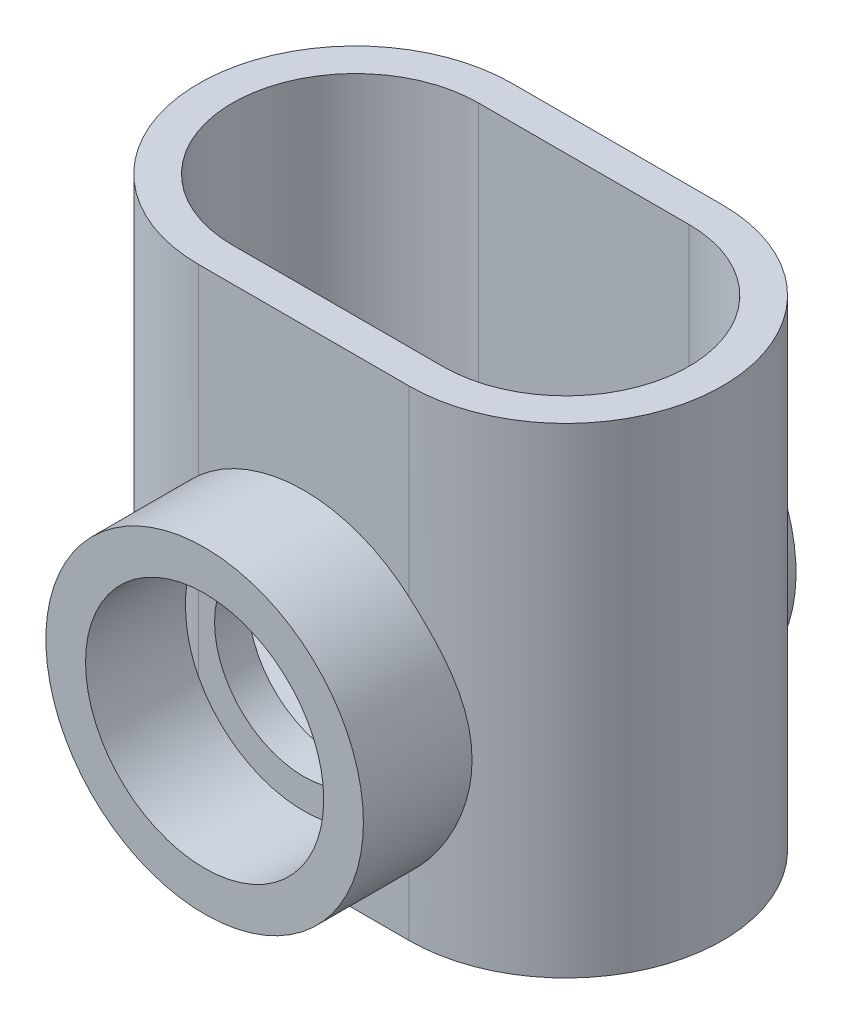
ISO-10303-21;
HEADER;
FILE_DESCRIPTION(('STEP AP214'),'2;1');
FILE_NAME('part.step','',(''),(''),'','','');
FILE_SCHEMA(('AUTOMOTIVE_DESIGN { 1 0 10303 214 1 1 1 1 }'));
ENDSEC;
DATA;
#1=APPLICATION_CONTEXT('core data for automotive mechanical design processes');
#2=APPLICATION_PROTOCOL_DEFINITION('international standard','automotive_design',2000,#1);
#3=PRODUCT_CONTEXT('',#1,'mechanical');
#4=PRODUCT('Part','Part','',(#3));
#5=PRODUCT_RELATED_PRODUCT_CATEGORY('part','',(#4));
#6=PRODUCT_DEFINITION_FORMATION('','',#4);
#7=PRODUCT_DEFINITION_CONTEXT('part definition',#1,'design');
#8=PRODUCT_DEFINITION('design','',#6,#7);
#9=PRODUCT_DEFINITION_SHAPE('','',#8);
#10=(LENGTH_UNIT() NAMED_UNIT(*) SI_UNIT(.MILLI.,.METRE.));
#11=(NAMED_UNIT(*) PLANE_ANGLE_UNIT() SI_UNIT($,.RADIAN.));
#12=(NAMED_UNIT(*) SI_UNIT($,.STERADIAN.) SOLID_ANGLE_UNIT());
#13=UNCERTAINTY_MEASURE_WITH_UNIT(LENGTH_MEASURE(1.E-05),#10,'distance_accuracy_value','');
#14=(GEOMETRIC_REPRESENTATION_CONTEXT(3) GLOBAL_UNCERTAINTY_ASSIGNED_CONTEXT((#13)) GLOBAL_UNIT_ASSIGNED_CONTEXT((#10,
#11,#12)) REPRESENTATION_CONTEXT('',''));
#15=CARTESIAN_POINT('',(0.,0.,0.));
#16=DIRECTION('',(0.,0.,1.));
#17=DIRECTION('',(1.,0.,0.));
#18=AXIS2_PLACEMENT_3D('',#15,#16,#17);
#19=CARTESIAN_POINT('',(0.,24.2,-7.9));
#20=DIRECTION('',(0.,0.,1.));
#21=DIRECTION('',(1.,0.,0.));
#22=AXIS2_PLACEMENT_3D('',#19,#20,#21);
#23=PLANE('',#22);
#24=CARTESIAN_POINT('',(5.3,9.,-7.9));
#25=DIRECTION('',(0.,0.,-1.));
#26=DIRECTION('',(-1.,0.,0.));
#27=AXIS2_PLACEMENT_3D('',#24,#25,#26);
#28=CIRCLE('',#27,8.);
#29=CARTESIAN_POINT('',(10.6,3.00750469336854,-7.9));
#30=VERTEX_POINT('',#29);
#31=CARTESIAN_POINT('',(0.,3.00750469336855,-7.9));
#32=VERTEX_POINT('',#31);
#33=EDGE_CURVE('E55',#30,#32,#28,.T.);
#34=ORIENTED_EDGE('',*,*,#33,.F.);
#35=DIRECTION('',(0.,-1.,0.));
#36=VECTOR('',#35,1.);
#37=CARTESIAN_POINT('',(10.6,24.2,-7.9));
#38=LINE('',#37,#36);
#39=CARTESIAN_POINT('',(10.6,0.,-7.9));
#40=VERTEX_POINT('',#39);
#41=EDGE_CURVE('E151',#30,#40,#38,.T.);
#42=ORIENTED_EDGE('',*,*,#41,.T.);
#43=DIRECTION('',(-1.,0.,0.));
#44=VECTOR('',#43,1.);
#45=CARTESIAN_POINT('',(0.,0.,-7.9));
#46=LINE('',#45,#44);
#47=CARTESIAN_POINT('',(0.,0.,-7.9));
#48=VERTEX_POINT('',#47);
#49=EDGE_CURVE('E304',#40,#48,#46,.T.);
#50=ORIENTED_EDGE('',*,*,#49,.T.);
#51=DIRECTION('',(0.,-1.,0.));
#52=VECTOR('',#51,1.);
#53=CARTESIAN_POINT('',(0.,24.2,-7.9));
#54=LINE('',#53,#52);
#55=EDGE_CURVE('E60',#32,#48,#54,.T.);
#56=ORIENTED_EDGE('',*,*,#55,.F.);
#57=EDGE_LOOP('',(#34,#42,#50,#56));
#58=FACE_BOUND('',#57,.T.);
#59=ADVANCED_FACE('F39',(#58),#23,.F.);
#60=CARTESIAN_POINT('',(0.,14.9924953066315,-7.9));
#61=VERTEX_POINT('',#60);
#62=CARTESIAN_POINT('',(10.6,14.9924953066315,-7.9));
#63=VERTEX_POINT('',#62);
#64=EDGE_CURVE('E145',#61,#63,#28,.T.);
#65=ORIENTED_EDGE('',*,*,#64,.F.);
#66=CARTESIAN_POINT('',(0.,24.2,-7.9));
#67=VERTEX_POINT('',#66);
#68=EDGE_CURVE('E301',#67,#61,#54,.T.);
#69=ORIENTED_EDGE('',*,*,#68,.F.);
#70=DIRECTION('',(-1.,0.,0.));
#71=VECTOR('',#70,1.);
#72=CARTESIAN_POINT('',(0.,24.2,-7.9));
#73=LINE('',#72,#71);
#74=CARTESIAN_POINT('',(10.6,24.2,-7.9));
#75=VERTEX_POINT('',#74);
#76=EDGE_CURVE('E147',#75,#67,#73,.T.);
#77=ORIENTED_EDGE('',*,*,#76,.F.);
#78=EDGE_CURVE('E140',#75,#63,#38,.T.);
#79=ORIENTED_EDGE('',*,*,#78,.T.);
#80=EDGE_LOOP('',(#65,#69,#77,#79));
#81=FACE_BOUND('',#80,.T.);
#82=ADVANCED_FACE('F142',(#81),#23,.F.);
#83=CARTESIAN_POINT('',(0.,24.2,7.9));
#84=DIRECTION('',(0.,0.,-1.));
#85=DIRECTION('',(-1.,0.,0.));
#86=AXIS2_PLACEMENT_3D('',#83,#84,#85);
#87=PLANE('',#86);
#88=DIRECTION('',(0.,-1.,0.));
#89=VECTOR('',#88,1.);
#90=CARTESIAN_POINT('',(0.,24.2,7.9));
#91=LINE('',#90,#89);
#92=CARTESIAN_POINT('',(0.,24.2,7.9));
#93=VERTEX_POINT('',#92);
#94=CARTESIAN_POINT('',(0.,14.9924953066315,7.9));
#95=VERTEX_POINT('',#94);
#96=EDGE_CURVE('E12',#93,#95,#91,.T.);
#97=ORIENTED_EDGE('',*,*,#96,.T.);
#98=CARTESIAN_POINT('',(5.3,9.,7.90000000000646));
#99=DIRECTION('',(0.,0.,-1.));
#100=DIRECTION('',(-1.,0.,0.));
#101=AXIS2_PLACEMENT_3D('',#98,#99,#100);
#102=CIRCLE('',#101,8.);
#103=CARTESIAN_POINT('',(10.6,14.9924953066315,7.90000000000646));
#104=VERTEX_POINT('',#103);
#105=EDGE_CURVE('E224',#104,#95,#102,.F.);
#106=ORIENTED_EDGE('',*,*,#105,.F.);
#107=DIRECTION('',(0.,-1.,0.));
#108=VECTOR('',#107,1.);
#109=CARTESIAN_POINT('',(10.6,24.2,7.9));
#110=LINE('',#109,#108);
#111=CARTESIAN_POINT('',(10.6,24.2,7.9));
#112=VERTEX_POINT('',#111);
#113=EDGE_CURVE('E306',#112,#104,#110,.T.);
#114=ORIENTED_EDGE('',*,*,#113,.F.);
#115=DIRECTION('',(1.,0.,0.));
#116=VECTOR('',#115,1.);
#117=CARTESIAN_POINT('',(0.,24.2,7.9));
#118=LINE('',#117,#116);
#119=EDGE_CURVE('E225',#93,#112,#118,.T.);
#120=ORIENTED_EDGE('',*,*,#119,.F.);
#121=EDGE_LOOP('',(#97,#106,#114,#120));
#122=FACE_BOUND('',#121,.T.);
#123=ADVANCED_FACE('F197',(#122),#87,.F.);
#124=CARTESIAN_POINT('',(0.,24.2,0.));
#125=DIRECTION('',(0.,-1.,0.));
#126=DIRECTION('',(0.,0.,-1.));
#127=AXIS2_PLACEMENT_3D('',#124,#125,#126);
#128=CYLINDRICAL_SURFACE('',#127,7.9);
#129=CARTESIAN_POINT('',(0.,3.00750469336854,7.9));
#130=VERTEX_POINT('',#129);
#131=CARTESIAN_POINT('',(0.,0.,7.9));
#132=VERTEX_POINT('',#131);
#133=EDGE_CURVE('E48',#130,#132,#91,.T.);
#134=ORIENTED_EDGE('',*,*,#133,.F.);
#135=CARTESIAN_POINT('',(0.,14.9924953066315,7.9));
#136=CARTESIAN_POINT('',(-0.165659654042323,14.8460206283481,7.89999934958821));
#137=CARTESIAN_POINT('',(-0.325125716478624,14.6927039418768,7.89479037197899));
#138=CARTESIAN_POINT('',(-0.630504441524312,14.3737955911347,7.87628349925471));
#139=CARTESIAN_POINT('',(-0.776428295026014,14.2082142692084,7.86299235286839));
#140=CARTESIAN_POINT('',(-1.05369916417834,13.8661061195597,7.83065711055396));
#141=CARTESIAN_POINT('',(-1.18506043031419,13.6895902605375,7.81161870787881));
#142=CARTESIAN_POINT('',(-1.43266342855662,13.326604945252,7.77002182860017));
#143=CARTESIAN_POINT('',(-1.54890200233335,13.1401334212094,7.74746261884344));
#144=CARTESIAN_POINT('',(-1.76535237537247,12.7588238090764,7.70102332508906));
#145=CARTESIAN_POINT('',(-1.86559896624349,12.5640050863881,7.67714626492542));
#146=CARTESIAN_POINT('',(-2.04980814620565,12.1667420014171,7.63002810366607));
#147=CARTESIAN_POINT('',(-2.13377095767161,11.9642977433155,7.60678699388942));
#148=CARTESIAN_POINT('',(-2.2848637203706,11.5530034457817,7.56277686205978));
#149=CARTESIAN_POINT('',(-2.35199730782574,11.3441548010832,7.54200730649843));
#150=CARTESIAN_POINT('',(-2.46895935597311,10.9212989348312,7.50453305494014));
#151=CARTESIAN_POINT('',(-2.51878765816819,10.7072916660496,7.48782839617354));
#152=CARTESIAN_POINT('',(-2.60164662354409,10.2706221716192,7.45945075989015));
#153=CARTESIAN_POINT('',(-2.63426802769808,10.0478738839944,7.44790130089661));
#154=CARTESIAN_POINT('',(-2.68062892361512,9.60017193729785,7.43134163705504));
#155=CARTESIAN_POINT('',(-2.69436829056254,9.37521826365782,7.42633147543363));
#156=CARTESIAN_POINT('',(-2.70281529175459,8.92497740375368,7.42326142735091));
#157=CARTESIAN_POINT('',(-2.69752899363168,8.69969034671917,7.42519932502571));
#158=CARTESIAN_POINT('',(-2.66799541178477,8.25053326748999,7.43586214006958));
#159=CARTESIAN_POINT('',(-2.64374875180376,8.0266631989246,7.44458683417194));
#160=CARTESIAN_POINT('',(-2.57843553069375,7.59454677883346,7.46744846645516));
#161=CARTESIAN_POINT('',(-2.53838725389512,7.3861277165097,7.48125484962938));
#162=CARTESIAN_POINT('',(-2.44196525949885,6.97345808200345,7.51328044972511));
#163=CARTESIAN_POINT('',(-2.38559191676759,6.76920741421895,7.53149956531713));
#164=CARTESIAN_POINT('',(-2.25685676397906,6.36584055140364,7.57107207794247));
#165=CARTESIAN_POINT('',(-2.18447473154368,6.1667312094253,7.5924294276768));
#166=CARTESIAN_POINT('',(-2.02422693440841,5.77502193449221,7.63671468134105));
#167=CARTESIAN_POINT('',(-1.93636049541726,5.58242228544709,7.65964265363947));
#168=CARTESIAN_POINT('',(-1.7409570056299,5.1955065058327,7.70646807783583));
#169=CARTESIAN_POINT('',(-1.63266660248392,5.00156941317087,7.73035793101838));
#170=CARTESIAN_POINT('',(-1.40016919144706,4.62312234081302,7.77583138310324));
#171=CARTESIAN_POINT('',(-1.27595843103882,4.43861459805509,7.79741443607322));
#172=CARTESIAN_POINT('',(-1.01273479136636,4.08079536807202,7.83594359951493));
#173=CARTESIAN_POINT('',(-0.873766114614969,3.90745281228961,7.85290304295537));
#174=CARTESIAN_POINT('',(-0.581654865537745,3.57271709921554,7.87992091926252));
#175=CARTESIAN_POINT('',(-0.428524086428894,3.41131419746685,7.88998503638584));
#176=CARTESIAN_POINT('',(-0.225048015561031,3.21401815693188,7.89691598622943));
#177=CARTESIAN_POINT('',(-0.180692272938848,3.17198573349581,7.89806066824444));
#178=CARTESIAN_POINT('',(-0.0910468224072934,3.08896451586404,7.89960238262781));
#179=CARTESIAN_POINT('',(-0.0457576352332591,3.04797516684869,7.89999982102299));
#180=CARTESIAN_POINT('',(0.,3.00750469336854,7.9));
#181=B_SPLINE_CURVE_WITH_KNOTS('',3,(#135,#136,#137,#138,#139,#140,#141,#142,#143,#144,#145,
#146,#147,#148,#149,#150,#151,#152,#153,#154,#155,#156,#157,#158,#159,#160,#161,#162,#163,#164,
#165,#166,#167,#168,#169,#170,#171,#172,#173,#174,#175,#176,#177,#178,#179,#180),.UNSPECIFIED.,
.F.,.F.,(4,2,2,2,2,2,2,2,2,2,2,2,2,2,2,2,2,2,2,2,2,2,4),(0.,0.662981875407768,1.32541091002921,
1.98718588144885,2.64909884151636,3.30955152723226,3.96999519302776,4.63029603620857,
5.2906029268507,5.96597762938779,6.64135679632178,7.31652059157958,7.99166217676743,
8.62898434784936,9.26629188550103,9.90440912344751,10.5425541560181,11.2119948281525,
11.8815935823791,12.5492405041256,13.2163363776241,13.3996777805269,13.58291953311),.UNSPECIFIED.);
#182=EDGE_CURVE('E231',#95,#130,#181,.T.);
#183=ORIENTED_EDGE('',*,*,#182,.F.);
#184=ORIENTED_EDGE('',*,*,#96,.F.);
#185=CARTESIAN_POINT('',(0.,24.2,0.));
#186=DIRECTION('',(0.,1.,0.));
#187=DIRECTION('',(0.,0.,1.));
#188=AXIS2_PLACEMENT_3D('',#185,#186,#187);
#189=CIRCLE('',#188,7.9);
#190=EDGE_CURVE('E230',#67,#93,#189,.T.);
#191=ORIENTED_EDGE('',*,*,#190,.F.);
#192=ORIENTED_EDGE('',*,*,#68,.T.);
#193=DIRECTION('',(0.,-1.,0.));
#194=VECTOR('',#193,1.);
#195=CARTESIAN_POINT('',(0.,24.2,-7.9));
#196=LINE('',#195,#194);
#197=EDGE_CURVE('E161',#61,#32,#196,.T.);
#198=ORIENTED_EDGE('',*,*,#197,.T.);
#199=ORIENTED_EDGE('',*,*,#55,.T.);
#200=CARTESIAN_POINT('',(0.,0.,0.));
#201=DIRECTION('',(0.,1.,0.));
#202=DIRECTION('',(0.,0.,1.));
#203=AXIS2_PLACEMENT_3D('',#200,#201,#202);
#204=CIRCLE('',#203,7.9);
#205=EDGE_CURVE('E317',#48,#132,#204,.T.);
#206=ORIENTED_EDGE('',*,*,#205,.T.);
#207=EDGE_LOOP('',(#134,#183,#184,#191,#192,#198,#199,#206));
#208=FACE_BOUND('',#207,.T.);
#209=ADVANCED_FACE('F41',(#208),#128,.T.);
#210=CARTESIAN_POINT('',(10.6,3.00750469336854,7.9));
#211=VERTEX_POINT('',#210);
#212=CARTESIAN_POINT('',(10.6,0.,7.9));
#213=VERTEX_POINT('',#212);
#214=EDGE_CURVE('E150',#211,#213,#110,.T.);
#215=ORIENTED_EDGE('',*,*,#214,.F.);
#216=EDGE_CURVE('E240',#130,#211,#102,.F.);
#217=ORIENTED_EDGE('',*,*,#216,.F.);
#218=ORIENTED_EDGE('',*,*,#133,.T.);
#219=DIRECTION('',(1.,0.,0.));
#220=VECTOR('',#219,1.);
#221=CARTESIAN_POINT('',(0.,0.,7.9));
#222=LINE('',#221,#220);
#223=EDGE_CURVE('E314',#132,#213,#222,.T.);
#224=ORIENTED_EDGE('',*,*,#223,.T.);
#225=EDGE_LOOP('',(#215,#217,#218,#224));
#226=FACE_BOUND('',#225,.T.);
#227=ADVANCED_FACE('F204',(#226),#87,.F.);
#228=CARTESIAN_POINT('',(10.6,24.2,0.));
#229=DIRECTION('',(0.,-1.,0.));
#230=DIRECTION('',(0.,0.,-1.));
#231=AXIS2_PLACEMENT_3D('',#228,#229,#230);
#232=CYLINDRICAL_SURFACE('',#231,7.9);
#233=ORIENTED_EDGE('',*,*,#113,.T.);
#234=CARTESIAN_POINT('',(10.6,3.00750469336854,7.9));
#235=CARTESIAN_POINT('',(10.7656596540423,3.15397937165192,7.89999934958821));
#236=CARTESIAN_POINT('',(10.9251257164786,3.30729605812319,7.89479037197899));
#237=CARTESIAN_POINT('',(11.2305044415243,3.62620440886528,7.87628349925471));
#238=CARTESIAN_POINT('',(11.376428295026,3.79178573079156,7.86299235286839));
#239=CARTESIAN_POINT('',(11.6536991641783,4.13389388044027,7.83065711055396));
#240=CARTESIAN_POINT('',(11.7850604303142,4.31040973946249,7.81161870787881));
#241=CARTESIAN_POINT('',(12.0326634285566,4.67339505474797,7.77002182860017));
#242=CARTESIAN_POINT('',(12.1489020023334,4.85986657879061,7.74746261884344));
#243=CARTESIAN_POINT('',(12.3653523753725,5.24117619092359,7.70102332508906));
#244=CARTESIAN_POINT('',(12.4655989662435,5.43599491361189,7.67714626492542));
#245=CARTESIAN_POINT('',(12.6498081462056,5.83325799858287,7.63002810366607));
#246=CARTESIAN_POINT('',(12.7337709576716,6.03570225668449,7.60678699388942));
#247=CARTESIAN_POINT('',(12.8848637203706,6.44699655421832,7.56277686205978));
#248=CARTESIAN_POINT('',(12.9519973078257,6.65584519891677,7.54200730649843));
#249=CARTESIAN_POINT('',(13.0689593559731,7.07870106516878,7.50453305494014));
#250=CARTESIAN_POINT('',(13.1187876581682,7.29270833395039,7.48782839617354));
#251=CARTESIAN_POINT('',(13.2016466235441,7.72937782838078,7.45945075989015));
#252=CARTESIAN_POINT('',(13.2342680276981,7.9521261160056,7.44790130089661));
#253=CARTESIAN_POINT('',(13.2806289236151,8.39982806270214,7.43134163705504));
#254=CARTESIAN_POINT('',(13.2943682905625,8.62478173634218,7.42633147543363));
#255=CARTESIAN_POINT('',(13.3028152917546,9.07502259624631,7.42326142735091));
#256=CARTESIAN_POINT('',(13.2975289936317,9.30030965328083,7.42519932502571));
#257=CARTESIAN_POINT('',(13.2679954117848,9.74946673251,7.43586214006958));
#258=CARTESIAN_POINT('',(13.2437487518038,9.97333680107539,7.44458683417194));
#259=CARTESIAN_POINT('',(13.1784355306938,10.4054532211665,7.46744846645516));
#260=CARTESIAN_POINT('',(13.1383872538951,10.6138722834903,7.48125484962938));
#261=CARTESIAN_POINT('',(13.0419652594989,11.0265419179965,7.51328044972511));
#262=CARTESIAN_POINT('',(12.9855919167676,11.230792585781,7.53149956531713));
#263=CARTESIAN_POINT('',(12.8568567639791,11.6341594485963,7.57107207794247));
#264=CARTESIAN_POINT('',(12.7844747315437,11.8332687905747,7.5924294276768));
#265=CARTESIAN_POINT('',(12.6242269344084,12.2249780655078,7.63671468134105));
#266=CARTESIAN_POINT('',(12.5363604954173,12.4175777145529,7.65964265363947));
#267=CARTESIAN_POINT('',(12.3409570056299,12.8044934941673,7.70646807783583));
#268=CARTESIAN_POINT('',(12.2326666024839,12.9984305868291,7.73035793101838));
#269=CARTESIAN_POINT('',(12.0001691914471,13.376877659187,7.77583138310323));
#270=CARTESIAN_POINT('',(11.8759584310388,13.5613854019449,7.79741443607321));
#271=CARTESIAN_POINT('',(11.6127347913664,13.919204631928,7.83594359951493));
#272=CARTESIAN_POINT('',(11.473766114615,14.0925471877104,7.85290304295537));
#273=CARTESIAN_POINT('',(11.1816548655378,14.4272829007845,7.87992091926252));
#274=CARTESIAN_POINT('',(11.0285240864289,14.5886858025331,7.88998503638584));
#275=CARTESIAN_POINT('',(10.825048015561,14.7859818430681,7.89691598622943));
#276=CARTESIAN_POINT('',(10.7806922729389,14.8280142665042,7.89806066824444));
#277=CARTESIAN_POINT('',(10.6910468224073,14.911035484136,7.89960238262781));
#278=CARTESIAN_POINT('',(10.6457576352333,14.9520248331513,7.89999982102299));
#279=CARTESIAN_POINT('',(10.6,14.9924953066315,7.9));
#280=B_SPLINE_CURVE_WITH_KNOTS('',3,(#234,#235,#236,#237,#238,#239,#240,#241,#242,#243,#244,
#245,#246,#247,#248,#249,#250,#251,#252,#253,#254,#255,#256,#257,#258,#259,#260,#261,#262,#263,
#264,#265,#266,#267,#268,#269,#270,#271,#272,#273,#274,#275,#276,#277,#278,#279),.UNSPECIFIED.,
.F.,.F.,(4,2,2,2,2,2,2,2,2,2,2,2,2,2,2,2,2,2,2,2,2,2,4),(0.,0.662981875407767,1.32541091002921,
1.98718588144885,2.64909884151636,3.30955152723226,3.96999519302775,4.63029603620857,
5.2906029268507,5.96597762938779,6.64135679632178,7.31652059157957,7.99166217676742,
8.62898434784936,9.26629188550102,9.90440912344751,10.5425541560181,11.2119948281525,
11.8815935823791,12.5492405041256,13.2163363776241,13.3996777805269,13.58291953311),.UNSPECIFIED.);
#281=EDGE_CURVE('E282',#211,#104,#280,.T.);
#282=ORIENTED_EDGE('',*,*,#281,.F.);
#283=ORIENTED_EDGE('',*,*,#214,.T.);
#284=CARTESIAN_POINT('',(10.6,0.,0.));
#285=DIRECTION('',(0.,1.,0.));
#286=DIRECTION('',(0.,0.,1.));
#287=AXIS2_PLACEMENT_3D('',#284,#285,#286);
#288=CIRCLE('',#287,7.9);
#289=EDGE_CURVE('E311',#213,#40,#288,.T.);
#290=ORIENTED_EDGE('',*,*,#289,.T.);
#291=ORIENTED_EDGE('',*,*,#41,.F.);
#292=DIRECTION('',(0.,-1.,0.));
#293=VECTOR('',#292,1.);
#294=CARTESIAN_POINT('',(10.6,24.2,-7.9));
#295=LINE('',#294,#293);
#296=EDGE_CURVE('E154',#63,#30,#295,.T.);
#297=ORIENTED_EDGE('',*,*,#296,.F.);
#298=ORIENTED_EDGE('',*,*,#78,.F.);
#299=CARTESIAN_POINT('',(10.6,24.2,0.));
#300=DIRECTION('',(0.,1.,0.));
#301=DIRECTION('',(0.,0.,1.));
#302=AXIS2_PLACEMENT_3D('',#299,#300,#301);
#303=CIRCLE('',#302,7.9);
#304=EDGE_CURVE('E323',#112,#75,#303,.T.);
#305=ORIENTED_EDGE('',*,*,#304,.F.);
#306=EDGE_LOOP('',(#233,#282,#283,#290,#291,#297,#298,#305));
#307=FACE_BOUND('',#306,.T.);
#308=ADVANCED_FACE('F157',(#307),#232,.T.);
#309=CARTESIAN_POINT('',(0.,24.2,0.));
#310=DIRECTION('',(0.,1.,0.));
#311=DIRECTION('',(0.,0.,1.));
#312=AXIS2_PLACEMENT_3D('',#309,#310,#311);
#313=PLANE('',#312);
#314=CARTESIAN_POINT('',(0.,24.2,0.));
#315=DIRECTION('',(0.,1.,0.));
#316=DIRECTION('',(0.,0.,1.));
#317=AXIS2_PLACEMENT_3D('',#314,#315,#316);
#318=CIRCLE('',#317,6.2);
#319=CARTESIAN_POINT('',(0.,24.2,-6.2));
#320=VERTEX_POINT('',#319);
#321=CARTESIAN_POINT('',(0.,24.2,6.2));
#322=VERTEX_POINT('',#321);
#323=EDGE_CURVE('E335',#320,#322,#318,.T.);
#324=ORIENTED_EDGE('',*,*,#323,.F.);
#325=DIRECTION('',(-1.,0.,0.));
#326=VECTOR('',#325,1.);
#327=CARTESIAN_POINT('',(0.,24.2,-6.2));
#328=LINE('',#327,#326);
#329=CARTESIAN_POINT('',(10.6,24.2,-6.2));
#330=VERTEX_POINT('',#329);
#331=EDGE_CURVE('E327',#330,#320,#328,.T.);
#332=ORIENTED_EDGE('',*,*,#331,.F.);
#333=CARTESIAN_POINT('',(10.6,24.2,0.));
#334=DIRECTION('',(0.,1.,0.));
#335=DIRECTION('',(0.,0.,1.));
#336=AXIS2_PLACEMENT_3D('',#333,#334,#335);
#337=CIRCLE('',#336,6.2);
#338=CARTESIAN_POINT('',(10.6,24.2,6.2));
#339=VERTEX_POINT('',#338);
#340=EDGE_CURVE('E330',#339,#330,#337,.T.);
#341=ORIENTED_EDGE('',*,*,#340,.F.);
#342=DIRECTION('',(1.,0.,0.));
#343=VECTOR('',#342,1.);
#344=CARTESIAN_POINT('',(0.,24.2,6.2));
#345=LINE('',#344,#343);
#346=EDGE_CURVE('E333',#322,#339,#345,.T.);
#347=ORIENTED_EDGE('',*,*,#346,.F.);
#348=EDGE_LOOP('',(#324,#332,#341,#347));
#349=FACE_BOUND('',#348,.T.);
#350=ORIENTED_EDGE('',*,*,#190,.T.);
#351=ORIENTED_EDGE('',*,*,#119,.T.);
#352=ORIENTED_EDGE('',*,*,#304,.T.);
#353=ORIENTED_EDGE('',*,*,#76,.T.);
#354=EDGE_LOOP('',(#350,#351,#352,#353));
#355=FACE_BOUND('',#354,.T.);
#356=ADVANCED_FACE('F203',(#349,#355),#313,.T.);
#357=CARTESIAN_POINT('',(0.,0.,0.));
#358=DIRECTION('',(0.,1.,0.));
#359=DIRECTION('',(0.,0.,1.));
#360=AXIS2_PLACEMENT_3D('',#357,#358,#359);
#361=PLANE('',#360);
#362=ORIENTED_EDGE('',*,*,#205,.F.);
#363=ORIENTED_EDGE('',*,*,#49,.F.);
#364=ORIENTED_EDGE('',*,*,#289,.F.);
#365=ORIENTED_EDGE('',*,*,#223,.F.);
#366=EDGE_LOOP('',(#362,#363,#364,#365));
#367=FACE_BOUND('',#366,.T.);
#368=ADVANCED_FACE('F200',(#367),#361,.F.);
#369=CARTESIAN_POINT('',(0.,24.2,0.));
#370=DIRECTION('',(0.,-1.,0.));
#371=DIRECTION('',(0.,0.,-1.));
#372=AXIS2_PLACEMENT_3D('',#369,#370,#371);
#373=CYLINDRICAL_SURFACE('',#372,6.2);
#374=CARTESIAN_POINT('',(0.,1.7,0.));
#375=DIRECTION('',(0.,1.,0.));
#376=DIRECTION('',(0.,0.,1.));
#377=AXIS2_PLACEMENT_3D('',#374,#375,#376);
#378=CIRCLE('',#377,6.2);
#379=CARTESIAN_POINT('',(0.,1.7,-6.2));
#380=VERTEX_POINT('',#379);
#381=CARTESIAN_POINT('',(0.,1.7,6.2));
#382=VERTEX_POINT('',#381);
#383=EDGE_CURVE('E267',#380,#382,#378,.T.);
#384=ORIENTED_EDGE('',*,*,#383,.F.);
#385=DIRECTION('',(0.,-1.,0.));
#386=VECTOR('',#385,1.);
#387=CARTESIAN_POINT('',(0.,24.2,-6.2));
#388=LINE('',#387,#386);
#389=EDGE_CURVE('E329',#320,#380,#388,.T.);
#390=ORIENTED_EDGE('',*,*,#389,.F.);
#391=ORIENTED_EDGE('',*,*,#323,.T.);
#392=DIRECTION('',(0.,1.,0.));
#393=VECTOR('',#392,1.);
#394=CARTESIAN_POINT('',(0.,24.2,6.2));
#395=LINE('',#394,#393);
#396=EDGE_CURVE('E321',#322,#382,#395,.F.);
#397=ORIENTED_EDGE('',*,*,#396,.T.);
#398=EDGE_LOOP('',(#384,#390,#391,#397));
#399=FACE_BOUND('',#398,.T.);
#400=ADVANCED_FACE('F275',(#399),#373,.F.);
#401=CARTESIAN_POINT('',(0.,24.2,6.2));
#402=DIRECTION('',(0.,0.,-1.));
#403=DIRECTION('',(-1.,0.,0.));
#404=AXIS2_PLACEMENT_3D('',#401,#402,#403);
#405=PLANE('',#404);
#406=CARTESIAN_POINT('',(5.3,9.,6.2));
#407=DIRECTION('',(0.,0.,-1.));
#408=DIRECTION('',(-1.,0.,0.));
#409=AXIS2_PLACEMENT_3D('',#406,#407,#408);
#410=CIRCLE('',#409,4.5);
#411=CARTESIAN_POINT('',(0.800000000000001,9.,6.2));
#412=VERTEX_POINT('',#411);
#413=EDGE_CURVE('E265',#412,#412,#410,.T.);
#414=ORIENTED_EDGE('',*,*,#413,.F.);
#415=EDGE_LOOP('',(#414));
#416=FACE_BOUND('',#415,.T.);
#417=DIRECTION('',(1.,0.,0.));
#418=VECTOR('',#417,1.);
#419=CARTESIAN_POINT('',(0.,1.7,6.2));
#420=LINE('',#419,#418);
#421=CARTESIAN_POINT('',(10.6,1.7,6.2));
#422=VERTEX_POINT('',#421);
#423=EDGE_CURVE('E345',#382,#422,#420,.T.);
#424=ORIENTED_EDGE('',*,*,#423,.F.);
#425=ORIENTED_EDGE('',*,*,#396,.F.);
#426=ORIENTED_EDGE('',*,*,#346,.T.);
#427=DIRECTION('',(0.,-1.,0.));
#428=VECTOR('',#427,1.);
#429=CARTESIAN_POINT('',(10.6,24.2,6.2));
#430=LINE('',#429,#428);
#431=EDGE_CURVE('E343',#339,#422,#430,.T.);
#432=ORIENTED_EDGE('',*,*,#431,.T.);
#433=EDGE_LOOP('',(#424,#425,#426,#432));
#434=FACE_BOUND('',#433,.T.);
#435=ADVANCED_FACE('F405',(#416,#434),#405,.T.);
#436=CARTESIAN_POINT('',(10.6,24.2,0.));
#437=DIRECTION('',(0.,-1.,0.));
#438=DIRECTION('',(0.,0.,-1.));
#439=AXIS2_PLACEMENT_3D('',#436,#437,#438);
#440=CYLINDRICAL_SURFACE('',#439,6.2);
#441=CARTESIAN_POINT('',(10.6,1.7,0.));
#442=DIRECTION('',(0.,1.,0.));
#443=DIRECTION('',(0.,0.,1.));
#444=AXIS2_PLACEMENT_3D('',#441,#442,#443);
#445=CIRCLE('',#444,6.2);
#446=CARTESIAN_POINT('',(10.6,1.7,-6.2));
#447=VERTEX_POINT('',#446);
#448=EDGE_CURVE('E339',#422,#447,#445,.T.);
#449=ORIENTED_EDGE('',*,*,#448,.F.);
#450=ORIENTED_EDGE('',*,*,#431,.F.);
#451=ORIENTED_EDGE('',*,*,#340,.T.);
#452=DIRECTION('',(0.,1.,0.));
#453=VECTOR('',#452,1.);
#454=CARTESIAN_POINT('',(10.6,24.2,-6.2));
#455=LINE('',#454,#453);
#456=EDGE_CURVE('E340',#330,#447,#455,.F.);
#457=ORIENTED_EDGE('',*,*,#456,.T.);
#458=EDGE_LOOP('',(#449,#450,#451,#457));
#459=FACE_BOUND('',#458,.T.);
#460=ADVANCED_FACE('F407',(#459),#440,.F.);
#461=CARTESIAN_POINT('',(0.,24.2,-6.2));
#462=DIRECTION('',(0.,0.,1.));
#463=DIRECTION('',(1.,0.,0.));
#464=AXIS2_PLACEMENT_3D('',#461,#462,#463);
#465=PLANE('',#464);
#466=CARTESIAN_POINT('',(5.3,9.,-6.2));
#467=DIRECTION('',(0.,0.,1.));
#468=DIRECTION('',(1.,0.,0.));
#469=AXIS2_PLACEMENT_3D('',#466,#467,#468);
#470=CIRCLE('',#469,4.5);
#471=CARTESIAN_POINT('',(9.8,9.,-6.2));
#472=VERTEX_POINT('',#471);
#473=EDGE_CURVE('E294',#472,#472,#470,.T.);
#474=ORIENTED_EDGE('',*,*,#473,.F.);
#475=EDGE_LOOP('',(#474));
#476=FACE_BOUND('',#475,.T.);
#477=DIRECTION('',(-1.,0.,0.));
#478=VECTOR('',#477,1.);
#479=CARTESIAN_POINT('',(0.,1.7,-6.2));
#480=LINE('',#479,#478);
#481=EDGE_CURVE('E337',#447,#380,#480,.T.);
#482=ORIENTED_EDGE('',*,*,#481,.F.);
#483=ORIENTED_EDGE('',*,*,#456,.F.);
#484=ORIENTED_EDGE('',*,*,#331,.T.);
#485=ORIENTED_EDGE('',*,*,#389,.T.);
#486=EDGE_LOOP('',(#482,#483,#484,#485));
#487=FACE_BOUND('',#486,.T.);
#488=ADVANCED_FACE('F373',(#476,#487),#465,.T.);
#489=CARTESIAN_POINT('',(0.,1.7,0.));
#490=DIRECTION('',(0.,1.,0.));
#491=DIRECTION('',(0.,0.,1.));
#492=AXIS2_PLACEMENT_3D('',#489,#490,#491);
#493=PLANE('',#492);
#494=ORIENTED_EDGE('',*,*,#383,.T.);
#495=ORIENTED_EDGE('',*,*,#423,.T.);
#496=ORIENTED_EDGE('',*,*,#448,.T.);
#497=ORIENTED_EDGE('',*,*,#481,.T.);
#498=EDGE_LOOP('',(#494,#495,#496,#497));
#499=FACE_BOUND('',#498,.T.);
#500=ADVANCED_FACE('F274',(#499),#493,.T.);
#501=CARTESIAN_POINT('',(5.3,9.,12.9));
#502=DIRECTION('',(0.,0.,1.));
#503=DIRECTION('',(1.,0.,0.));
#504=AXIS2_PLACEMENT_3D('',#501,#502,#503);
#505=PLANE('',#504);
#506=CARTESIAN_POINT('',(5.3,9.,12.9));
#507=DIRECTION('',(0.,0.,1.));
#508=DIRECTION('',(1.,0.,0.));
#509=AXIS2_PLACEMENT_3D('',#506,#507,#508);
#510=CIRCLE('',#509,6.);
#511=CARTESIAN_POINT('',(11.3,9.,12.9));
#512=VERTEX_POINT('',#511);
#513=EDGE_CURVE('E235',#512,#512,#510,.T.);
#514=ORIENTED_EDGE('',*,*,#513,.F.);
#515=EDGE_LOOP('',(#514));
#516=FACE_BOUND('',#515,.T.);
#517=CARTESIAN_POINT('',(5.3,9.,12.9));
#518=DIRECTION('',(0.,0.,1.));
#519=DIRECTION('',(1.,0.,0.));
#520=AXIS2_PLACEMENT_3D('',#517,#518,#519);
#521=CIRCLE('',#520,8.);
#522=CARTESIAN_POINT('',(13.3,9.,12.9));
#523=VERTEX_POINT('',#522);
#524=EDGE_CURVE('E238',#523,#523,#521,.T.);
#525=ORIENTED_EDGE('',*,*,#524,.T.);
#526=EDGE_LOOP('',(#525));
#527=FACE_BOUND('',#526,.T.);
#528=ADVANCED_FACE('F254',(#516,#527),#505,.T.);
#529=CARTESIAN_POINT('',(5.3,9.,-500000.));
#530=DIRECTION('',(0.,0.,1.));
#531=DIRECTION('',(1.,0.,0.));
#532=AXIS2_PLACEMENT_3D('',#529,#530,#531);
#533=CYLINDRICAL_SURFACE('',#532,8.);
#534=ORIENTED_EDGE('',*,*,#524,.F.);
#535=EDGE_LOOP('',(#534));
#536=FACE_BOUND('',#535,.T.);
#537=ORIENTED_EDGE('',*,*,#216,.T.);
#538=ORIENTED_EDGE('',*,*,#281,.T.);
#539=ORIENTED_EDGE('',*,*,#105,.T.);
#540=ORIENTED_EDGE('',*,*,#182,.T.);
#541=EDGE_LOOP('',(#537,#538,#539,#540));
#542=FACE_BOUND('',#541,.T.);
#543=ADVANCED_FACE('F249',(#536,#542),#533,.T.);
#544=CARTESIAN_POINT('',(5.3,9.,-500000.));
#545=DIRECTION('',(0.,0.,1.));
#546=DIRECTION('',(1.,0.,0.));
#547=AXIS2_PLACEMENT_3D('',#544,#545,#546);
#548=CYLINDRICAL_SURFACE('',#547,6.);
#549=ORIENTED_EDGE('',*,*,#513,.T.);
#550=EDGE_LOOP('',(#549));
#551=FACE_BOUND('',#550,.T.);
#552=CARTESIAN_POINT('',(10.6,6.18752777791495,7.9));
#553=CARTESIAN_POINT('',(10.6790805471998,6.33651414947802,7.89997323660615));
#554=CARTESIAN_POINT('',(10.7518418225766,6.48884026956227,7.8988111817307));
#555=CARTESIAN_POINT('',(10.884282371974,6.79905162785776,7.89516854869423));
#556=CARTESIAN_POINT('',(10.9439625300033,6.95693648957737,7.89268805967049));
#557=CARTESIAN_POINT('',(11.049738402201,7.27695423492814,7.88736387011097));
#558=CARTESIAN_POINT('',(11.0958519278533,7.4390812416287,7.8845206528959));
#559=CARTESIAN_POINT('',(11.174281788363,7.76664263640514,7.87919762166755));
#560=CARTESIAN_POINT('',(11.2065983422142,7.93207697194151,7.87671780188662));
#561=CARTESIAN_POINT('',(11.2572249580515,8.26523150636491,7.87265522262622));
#562=CARTESIAN_POINT('',(11.2755230267573,8.43295353788884,7.87107323156831));
#563=CARTESIAN_POINT('',(11.2979342712188,8.76934956882856,7.86911784288428));
#564=CARTESIAN_POINT('',(11.3020475206383,8.9380235632961,7.86874443898177));
#565=CARTESIAN_POINT('',(11.2960601083395,9.27508045871283,7.86927624527519));
#566=CARTESIAN_POINT('',(11.2859624096922,9.44346341301694,7.87018118892784));
#567=CARTESIAN_POINT('',(11.2516320361947,9.77876358965709,7.87309804696391));
#568=CARTESIAN_POINT('',(11.2274004464001,9.94568092351013,7.87510987637129));
#569=CARTESIAN_POINT('',(11.1682715569829,10.2594122908694,7.87958405527873));
#570=CARTESIAN_POINT('',(11.13476678787,10.406491692121,7.88197661613016));
#571=CARTESIAN_POINT('',(11.0567816917615,10.6976996429017,7.88687976650289));
#572=CARTESIAN_POINT('',(11.0123023032452,10.8418284436066,7.88939034591714));
#573=CARTESIAN_POINT('',(10.91258159964,11.126421118013,7.8939725197307));
#574=CARTESIAN_POINT('',(10.8573336595896,11.2668826749453,7.89604384224679));
#575=CARTESIAN_POINT('',(10.7364081927655,11.5432774153934,7.89904929930371));
#576=CARTESIAN_POINT('',(10.6707291769023,11.679209949011,7.89998327131669));
#577=CARTESIAN_POINT('',(10.6,11.812472222085,7.9));
#578=B_SPLINE_CURVE_WITH_KNOTS('',3,(#552,#553,#554,#555,#556,#557,#558,#559,#560,#561,#562,
#563,#564,#565,#566,#567,#568,#569,#570,#571,#572,#573,#574,#575,#576,#577),.UNSPECIFIED.,.F.,
.F.,(4,2,2,2,2,2,2,2,2,2,2,2,4),(0.,0.505849234613769,1.01166427389717,1.51681223989679,
2.02195218758998,2.52752381819415,3.03309282328028,3.53855642969912,4.04398123689499,
4.49616079973534,4.94830170846662,5.40072166353971,5.8532062620258),.UNSPECIFIED.);
#579=CARTESIAN_POINT('',(10.6,6.18752777791495,7.90000000000646));
#580=VERTEX_POINT('',#579);
#581=CARTESIAN_POINT('',(10.6,11.812472222085,7.9));
#582=VERTEX_POINT('',#581);
#583=EDGE_CURVE('E278',#580,#582,#578,.T.);
#584=ORIENTED_EDGE('',*,*,#583,.F.);
#585=CARTESIAN_POINT('',(5.3,9.,7.90000000000646));
#586=DIRECTION('',(0.,0.,-1.));
#587=DIRECTION('',(-1.,0.,0.));
#588=AXIS2_PLACEMENT_3D('',#585,#586,#587);
#589=CIRCLE('',#588,6.);
#590=CARTESIAN_POINT('',(0.,6.18752777791495,7.90000000000646));
#591=VERTEX_POINT('',#590);
#592=EDGE_CURVE('E283',#591,#580,#589,.F.);
#593=ORIENTED_EDGE('',*,*,#592,.F.);
#594=CARTESIAN_POINT('',(0.,11.812472222085,7.9));
#595=CARTESIAN_POINT('',(-0.0790805471998358,11.663485850522,7.89997323660614));
#596=CARTESIAN_POINT('',(-0.151841822576644,11.5111597304377,7.8988111817307));
#597=CARTESIAN_POINT('',(-0.284282371973975,11.2009483721422,7.89516854869423));
#598=CARTESIAN_POINT('',(-0.343962530003275,11.0430635104226,7.89268805967049));
#599=CARTESIAN_POINT('',(-0.449738402201,10.7230457650719,7.88736387011097));
#600=CARTESIAN_POINT('',(-0.495851927853327,10.5609187583713,7.8845206528959));
#601=CARTESIAN_POINT('',(-0.574281788363043,10.2333573635948,7.87919762166755));
#602=CARTESIAN_POINT('',(-0.606598342214158,10.0679230280585,7.87671780188662));
#603=CARTESIAN_POINT('',(-0.657224958051491,9.73476849363508,7.87265522262622));
#604=CARTESIAN_POINT('',(-0.675523026757348,9.56704646211115,7.87107323156831));
#605=CARTESIAN_POINT('',(-0.697934271218755,9.23065043117144,7.86911784288428));
#606=CARTESIAN_POINT('',(-0.702047520638331,9.0619764367039,7.86874443898177));
#607=CARTESIAN_POINT('',(-0.696060108339506,8.72491954128717,7.86927624527519));
#608=CARTESIAN_POINT('',(-0.685962409692209,8.55653658698305,7.87018118892784));
#609=CARTESIAN_POINT('',(-0.651632036194671,8.2212364103429,7.87309804696392));
#610=CARTESIAN_POINT('',(-0.627400446400128,8.05431907648987,7.87510987637129));
#611=CARTESIAN_POINT('',(-0.568271556982903,7.74058770913055,7.87958405527873));
#612=CARTESIAN_POINT('',(-0.534766787869983,7.59350830787899,7.88197661613016));
#613=CARTESIAN_POINT('',(-0.456781691761545,7.30230035709828,7.88687976650289));
#614=CARTESIAN_POINT('',(-0.412302303245243,7.15817155639337,7.88939034591714));
#615=CARTESIAN_POINT('',(-0.312581599640001,6.87357888198702,7.8939725197307));
#616=CARTESIAN_POINT('',(-0.257333659589626,6.73311732505465,7.89604384224679));
#617=CARTESIAN_POINT('',(-0.136408192765513,6.45672258460657,7.89904929930371));
#618=CARTESIAN_POINT('',(-0.0707291769023194,6.320790050989,7.89998327131669));
#619=CARTESIAN_POINT('',(0.,6.18752777791495,7.9));
#620=B_SPLINE_CURVE_WITH_KNOTS('',3,(#594,#595,#596,#597,#598,#599,#600,#601,#602,#603,#604,
#605,#606,#607,#608,#609,#610,#611,#612,#613,#614,#615,#616,#617,#618,#619),.UNSPECIFIED.,.F.,
.F.,(4,2,2,2,2,2,2,2,2,2,2,2,4),(0.,0.505849234613767,1.01166427389717,1.51681223989679,
2.02195218758998,2.52752381819414,3.03309282328027,3.53855642969911,4.04398123689499,
4.49616079973534,4.94830170846661,5.4007216635397,5.8532062620258),.UNSPECIFIED.);
#621=CARTESIAN_POINT('',(0.,11.812472222085,7.90000000000646));
#622=VERTEX_POINT('',#621);
#623=EDGE_CURVE('E258',#622,#591,#620,.T.);
#624=ORIENTED_EDGE('',*,*,#623,.F.);
#625=EDGE_CURVE('E264',#582,#622,#589,.F.);
#626=ORIENTED_EDGE('',*,*,#625,.F.);
#627=EDGE_LOOP('',(#584,#593,#624,#626));
#628=FACE_BOUND('',#627,.T.);
#629=ADVANCED_FACE('F269',(#551,#628),#548,.F.);
#630=ORIENTED_EDGE('',*,*,#583,.T.);
#631=EDGE_CURVE('E307',#582,#580,#110,.T.);
#632=ORIENTED_EDGE('',*,*,#631,.T.);
#633=EDGE_LOOP('',(#630,#632));
#634=FACE_BOUND('',#633,.T.);
#635=ADVANCED_FACE('F205',(#634),#232,.T.);
#636=CARTESIAN_POINT('',(5.3,9.,7.9));
#637=DIRECTION('',(0.,0.,1.));
#638=DIRECTION('',(1.,0.,0.));
#639=AXIS2_PLACEMENT_3D('',#636,#637,#638);
#640=CIRCLE('',#639,4.5);
#641=CARTESIAN_POINT('',(9.8,9.,7.9));
#642=VERTEX_POINT('',#641);
#643=EDGE_CURVE('E297',#642,#642,#640,.T.);
#644=ORIENTED_EDGE('',*,*,#643,.F.);
#645=EDGE_LOOP('',(#644));
#646=FACE_BOUND('',#645,.T.);
#647=ORIENTED_EDGE('',*,*,#625,.T.);
#648=EDGE_CURVE('E47',#622,#591,#91,.T.);
#649=ORIENTED_EDGE('',*,*,#648,.T.);
#650=ORIENTED_EDGE('',*,*,#592,.T.);
#651=ORIENTED_EDGE('',*,*,#631,.F.);
#652=EDGE_LOOP('',(#647,#649,#650,#651));
#653=FACE_BOUND('',#652,.T.);
#654=ADVANCED_FACE('F208',(#646,#653),#87,.F.);
#655=ORIENTED_EDGE('',*,*,#623,.T.);
#656=ORIENTED_EDGE('',*,*,#648,.F.);
#657=EDGE_LOOP('',(#655,#656));
#658=FACE_BOUND('',#657,.T.);
#659=ADVANCED_FACE('F213',(#658),#128,.T.);
#660=CARTESIAN_POINT('',(5.3,9.,-7.9));
#661=DIRECTION('',(0.,0.,1.));
#662=DIRECTION('',(1.,0.,0.));
#663=AXIS2_PLACEMENT_3D('',#660,#661,#662);
#664=CYLINDRICAL_SURFACE('',#663,4.5);
#665=ORIENTED_EDGE('',*,*,#413,.T.);
#666=EDGE_LOOP('',(#665));
#667=FACE_BOUND('',#666,.T.);
#668=ORIENTED_EDGE('',*,*,#643,.T.);
#669=EDGE_LOOP('',(#668));
#670=FACE_BOUND('',#669,.T.);
#671=ADVANCED_FACE('F392',(#667,#670),#664,.F.);
#672=ORIENTED_EDGE('',*,*,#473,.T.);
#673=EDGE_LOOP('',(#672));
#674=FACE_BOUND('',#673,.T.);
#675=CARTESIAN_POINT('',(5.3,9.,-8.9));
#676=DIRECTION('',(0.,0.,-1.));
#677=DIRECTION('',(-1.,0.,0.));
#678=AXIS2_PLACEMENT_3D('',#675,#676,#677);
#679=CIRCLE('',#678,4.5);
#680=CARTESIAN_POINT('',(0.800000000000002,9.,-8.9));
#681=VERTEX_POINT('',#680);
#682=EDGE_CURVE('E174',#681,#681,#679,.T.);
#683=ORIENTED_EDGE('',*,*,#682,.T.);
#684=EDGE_LOOP('',(#683));
#685=FACE_BOUND('',#684,.T.);
#686=ADVANCED_FACE('F179',(#674,#685),#664,.F.);
#687=CARTESIAN_POINT('',(5.3,9.,-7.9));
#688=DIRECTION('',(0.,0.,-1.));
#689=DIRECTION('',(-1.,0.,0.));
#690=AXIS2_PLACEMENT_3D('',#687,#688,#689);
#691=PLANE('',#690);
#692=EDGE_CURVE('E164',#63,#30,#28,.T.);
#693=ORIENTED_EDGE('',*,*,#692,.F.);
#694=ORIENTED_EDGE('',*,*,#296,.T.);
#695=EDGE_LOOP('',(#693,#694));
#696=FACE_BOUND('',#695,.T.);
#697=ADVANCED_FACE('F165',(#696),#691,.F.);
#698=CARTESIAN_POINT('',(5.3,9.,-8.9));
#699=DIRECTION('',(0.,0.,-1.));
#700=DIRECTION('',(-1.,0.,0.));
#701=AXIS2_PLACEMENT_3D('',#698,#699,#700);
#702=PLANE('',#701);
#703=CARTESIAN_POINT('',(5.3,9.,-8.9));
#704=DIRECTION('',(0.,0.,-1.));
#705=DIRECTION('',(-1.,0.,0.));
#706=AXIS2_PLACEMENT_3D('',#703,#704,#705);
#707=CIRCLE('',#706,8.);
#708=CARTESIAN_POINT('',(-2.7,9.,-8.9));
#709=VERTEX_POINT('',#708);
#710=EDGE_CURVE('E162',#709,#709,#707,.T.);
#711=ORIENTED_EDGE('',*,*,#710,.T.);
#712=EDGE_LOOP('',(#711));
#713=FACE_BOUND('',#712,.T.);
#714=ORIENTED_EDGE('',*,*,#682,.F.);
#715=EDGE_LOOP('',(#714));
#716=FACE_BOUND('',#715,.T.);
#717=ADVANCED_FACE('F181',(#713,#716),#702,.T.);
#718=ORIENTED_EDGE('',*,*,#197,.F.);
#719=EDGE_CURVE('E171',#32,#61,#28,.T.);
#720=ORIENTED_EDGE('',*,*,#719,.F.);
#721=EDGE_LOOP('',(#718,#720));
#722=FACE_BOUND('',#721,.T.);
#723=ADVANCED_FACE('F183',(#722),#691,.F.);
#724=CARTESIAN_POINT('',(5.3,9.,-8.9));
#725=DIRECTION('',(0.,0.,1.));
#726=DIRECTION('',(1.,0.,0.));
#727=AXIS2_PLACEMENT_3D('',#724,#725,#726);
#728=CYLINDRICAL_SURFACE('',#727,8.);
#729=ORIENTED_EDGE('',*,*,#710,.F.);
#730=EDGE_LOOP('',(#729));
#731=FACE_BOUND('',#730,.T.);
#732=ORIENTED_EDGE('',*,*,#64,.T.);
#733=ORIENTED_EDGE('',*,*,#692,.T.);
#734=ORIENTED_EDGE('',*,*,#33,.T.);
#735=ORIENTED_EDGE('',*,*,#719,.T.);
#736=EDGE_LOOP('',(#732,#733,#734,#735));
#737=FACE_BOUND('',#736,.T.);
#738=ADVANCED_FACE('F169',(#731,#737),#728,.T.);
#739=CLOSED_SHELL('',(#59,#82,#123,#209,#227,#308,#356,#368,#400,#435,#460,#488,#500,#528,#543,
#629,#635,#654,#659,#671,#686,#697,#717,#723,#738));
#740=MANIFOLD_SOLID_BREP('B2',#739);
#741=ADVANCED_BREP_SHAPE_REPRESENTATION('',(#18,#740),#14);
#742=SHAPE_DEFINITION_REPRESENTATION(#9,#741);
ENDSEC;
END-ISO-10303-21;
